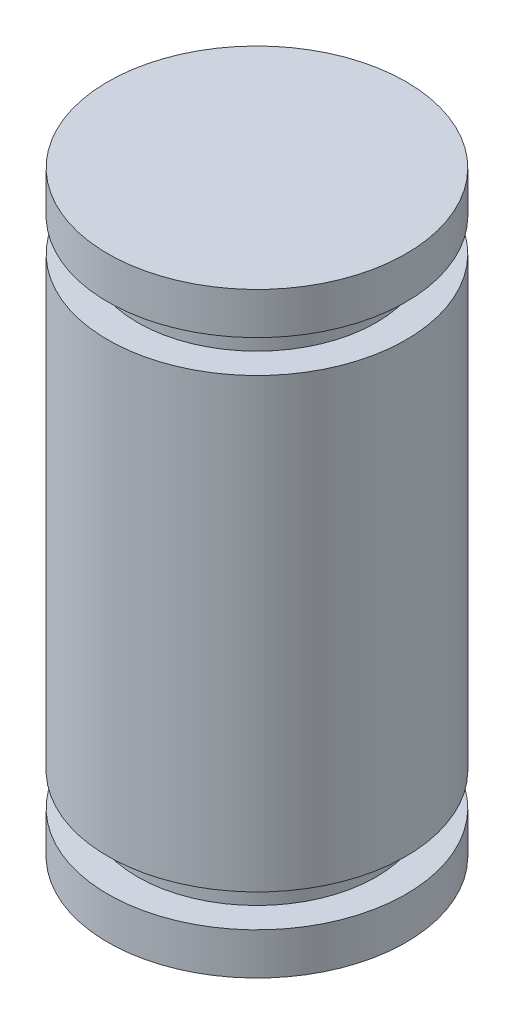
ISO-10303-21;
HEADER;
FILE_DESCRIPTION(('STEP AP214'),'2;1');
FILE_NAME('part.step','',(''),(''),'','','');
FILE_SCHEMA(('AUTOMOTIVE_DESIGN { 1 0 10303 214 1 1 1 1 }'));
ENDSEC;
DATA;
#1=APPLICATION_CONTEXT('core data for automotive mechanical design processes');
#2=APPLICATION_PROTOCOL_DEFINITION('international standard','automotive_design',2000,#1);
#3=PRODUCT_CONTEXT('',#1,'mechanical');
#4=PRODUCT('Part','Part','',(#3));
#5=PRODUCT_RELATED_PRODUCT_CATEGORY('part','',(#4));
#6=PRODUCT_DEFINITION_FORMATION('','',#4);
#7=PRODUCT_DEFINITION_CONTEXT('part definition',#1,'design');
#8=PRODUCT_DEFINITION('design','',#6,#7);
#9=PRODUCT_DEFINITION_SHAPE('','',#8);
#10=(LENGTH_UNIT() NAMED_UNIT(*) SI_UNIT(.MILLI.,.METRE.));
#11=(NAMED_UNIT(*) PLANE_ANGLE_UNIT() SI_UNIT($,.RADIAN.));
#12=(NAMED_UNIT(*) SI_UNIT($,.STERADIAN.) SOLID_ANGLE_UNIT());
#13=UNCERTAINTY_MEASURE_WITH_UNIT(LENGTH_MEASURE(1.E-05),#10,'distance_accuracy_value','');
#14=(GEOMETRIC_REPRESENTATION_CONTEXT(3) GLOBAL_UNCERTAINTY_ASSIGNED_CONTEXT((#13)) GLOBAL_UNIT_ASSIGNED_CONTEXT((#10,
#11,#12)) REPRESENTATION_CONTEXT('',''));
#15=CARTESIAN_POINT('',(0.,0.,0.));
#16=DIRECTION('',(0.,0.,1.));
#17=DIRECTION('',(1.,0.,0.));
#18=AXIS2_PLACEMENT_3D('',#15,#16,#17);
#19=CARTESIAN_POINT('',(0.,0.,0.));
#20=DIRECTION('',(0.,1.,0.));
#21=DIRECTION('',(0.,0.,1.));
#22=AXIS2_PLACEMENT_3D('',#19,#20,#21);
#23=PLANE('',#22);
#24=CARTESIAN_POINT('',(0.,0.,0.));
#25=DIRECTION('',(0.,-1.,0.));
#26=DIRECTION('',(0.,0.,-1.));
#27=AXIS2_PLACEMENT_3D('',#24,#25,#26);
#28=CIRCLE('',#27,5.);
#29=CARTESIAN_POINT('',(0.,0.,-5.));
#30=VERTEX_POINT('',#29);
#31=EDGE_CURVE('E10',#30,#30,#28,.T.);
#32=ORIENTED_EDGE('',*,*,#31,.T.);
#33=EDGE_LOOP('',(#32));
#34=FACE_BOUND('',#33,.T.);
#35=ADVANCED_FACE('F37',(#34),#23,.F.);
#36=CARTESIAN_POINT('',(0.,0.,0.));
#37=DIRECTION('',(0.,-1.,0.));
#38=DIRECTION('',(0.,0.,-1.));
#39=AXIS2_PLACEMENT_3D('',#36,#37,#38);
#40=CYLINDRICAL_SURFACE('',#39,5.);
#41=ORIENTED_EDGE('',*,*,#31,.F.);
#42=EDGE_LOOP('',(#41));
#43=FACE_BOUND('',#42,.T.);
#44=CARTESIAN_POINT('',(0.,1.4,0.));
#45=DIRECTION('',(0.,-1.,0.));
#46=DIRECTION('',(0.,0.,-1.));
#47=AXIS2_PLACEMENT_3D('',#44,#45,#46);
#48=CIRCLE('',#47,5.);
#49=CARTESIAN_POINT('',(0.,1.4,-5.));
#50=VERTEX_POINT('',#49);
#51=EDGE_CURVE('E44',#50,#50,#48,.T.);
#52=ORIENTED_EDGE('',*,*,#51,.T.);
#53=EDGE_LOOP('',(#52));
#54=FACE_BOUND('',#53,.T.);
#55=ADVANCED_FACE('F97',(#43,#54),#40,.T.);
#56=CARTESIAN_POINT('',(-5.,1.4,0.));
#57=DIRECTION('',(0.,-1.,0.));
#58=DIRECTION('',(0.,0.,-1.));
#59=AXIS2_PLACEMENT_3D('',#56,#57,#58);
#60=PLANE('',#59);
#61=ORIENTED_EDGE('',*,*,#51,.F.);
#62=EDGE_LOOP('',(#61));
#63=FACE_BOUND('',#62,.T.);
#64=CARTESIAN_POINT('',(0.,1.4,0.));
#65=DIRECTION('',(0.,-1.,0.));
#66=DIRECTION('',(0.,0.,-1.));
#67=AXIS2_PLACEMENT_3D('',#64,#65,#66);
#68=CIRCLE('',#67,4.);
#69=CARTESIAN_POINT('',(0.,1.4,-4.));
#70=VERTEX_POINT('',#69);
#71=EDGE_CURVE('E49',#70,#70,#68,.T.);
#72=ORIENTED_EDGE('',*,*,#71,.T.);
#73=EDGE_LOOP('',(#72));
#74=FACE_BOUND('',#73,.T.);
#75=ADVANCED_FACE('F101',(#63,#74),#60,.F.);
#76=CARTESIAN_POINT('',(0.,0.,0.));
#77=DIRECTION('',(0.,-1.,0.));
#78=DIRECTION('',(0.,0.,-1.));
#79=AXIS2_PLACEMENT_3D('',#76,#77,#78);
#80=CYLINDRICAL_SURFACE('',#79,4.);
#81=ORIENTED_EDGE('',*,*,#71,.F.);
#82=EDGE_LOOP('',(#81));
#83=FACE_BOUND('',#82,.T.);
#84=CARTESIAN_POINT('',(0.,2.5,0.));
#85=DIRECTION('',(0.,-1.,0.));
#86=DIRECTION('',(0.,0.,-1.));
#87=AXIS2_PLACEMENT_3D('',#84,#85,#86);
#88=CIRCLE('',#87,4.);
#89=CARTESIAN_POINT('',(0.,2.5,-4.));
#90=VERTEX_POINT('',#89);
#91=EDGE_CURVE('E54',#90,#90,#88,.T.);
#92=ORIENTED_EDGE('',*,*,#91,.T.);
#93=EDGE_LOOP('',(#92));
#94=FACE_BOUND('',#93,.T.);
#95=ADVANCED_FACE('F106',(#83,#94),#80,.T.);
#96=CARTESIAN_POINT('',(-4.,2.5,0.));
#97=DIRECTION('',(0.,1.,0.));
#98=DIRECTION('',(0.,0.,1.));
#99=AXIS2_PLACEMENT_3D('',#96,#97,#98);
#100=PLANE('',#99);
#101=ORIENTED_EDGE('',*,*,#91,.F.);
#102=EDGE_LOOP('',(#101));
#103=FACE_BOUND('',#102,.T.);
#104=CARTESIAN_POINT('',(0.,2.5,0.));
#105=DIRECTION('',(0.,-1.,0.));
#106=DIRECTION('',(0.,0.,-1.));
#107=AXIS2_PLACEMENT_3D('',#104,#105,#106);
#108=CIRCLE('',#107,5.);
#109=CARTESIAN_POINT('',(0.,2.5,-5.));
#110=VERTEX_POINT('',#109);
#111=EDGE_CURVE('E60',#110,#110,#108,.T.);
#112=ORIENTED_EDGE('',*,*,#111,.T.);
#113=EDGE_LOOP('',(#112));
#114=FACE_BOUND('',#113,.T.);
#115=ADVANCED_FACE('F112',(#103,#114),#100,.F.);
#116=CARTESIAN_POINT('',(0.,0.,0.));
#117=DIRECTION('',(0.,-1.,0.));
#118=DIRECTION('',(0.,0.,-1.));
#119=AXIS2_PLACEMENT_3D('',#116,#117,#118);
#120=CYLINDRICAL_SURFACE('',#119,5.);
#121=ORIENTED_EDGE('',*,*,#111,.F.);
#122=EDGE_LOOP('',(#121));
#123=FACE_BOUND('',#122,.T.);
#124=CARTESIAN_POINT('',(0.,17.5,0.));
#125=DIRECTION('',(0.,-1.,0.));
#126=DIRECTION('',(0.,0.,-1.));
#127=AXIS2_PLACEMENT_3D('',#124,#125,#126);
#128=CIRCLE('',#127,5.);
#129=CARTESIAN_POINT('',(0.,17.5,-5.));
#130=VERTEX_POINT('',#129);
#131=EDGE_CURVE('E64',#130,#130,#128,.T.);
#132=ORIENTED_EDGE('',*,*,#131,.T.);
#133=EDGE_LOOP('',(#132));
#134=FACE_BOUND('',#133,.T.);
#135=ADVANCED_FACE('F116',(#123,#134),#120,.T.);
#136=CARTESIAN_POINT('',(-5.,17.5,0.));
#137=DIRECTION('',(0.,-1.,0.));
#138=DIRECTION('',(0.,0.,-1.));
#139=AXIS2_PLACEMENT_3D('',#136,#137,#138);
#140=PLANE('',#139);
#141=ORIENTED_EDGE('',*,*,#131,.F.);
#142=EDGE_LOOP('',(#141));
#143=FACE_BOUND('',#142,.T.);
#144=CARTESIAN_POINT('',(0.,17.5,0.));
#145=DIRECTION('',(0.,-1.,0.));
#146=DIRECTION('',(0.,0.,-1.));
#147=AXIS2_PLACEMENT_3D('',#144,#145,#146);
#148=CIRCLE('',#147,4.);
#149=CARTESIAN_POINT('',(0.,17.5,-4.));
#150=VERTEX_POINT('',#149);
#151=EDGE_CURVE('E68',#150,#150,#148,.T.);
#152=ORIENTED_EDGE('',*,*,#151,.T.);
#153=EDGE_LOOP('',(#152));
#154=FACE_BOUND('',#153,.T.);
#155=ADVANCED_FACE('F120',(#143,#154),#140,.F.);
#156=CARTESIAN_POINT('',(0.,0.,0.));
#157=DIRECTION('',(0.,-1.,0.));
#158=DIRECTION('',(0.,0.,-1.));
#159=AXIS2_PLACEMENT_3D('',#156,#157,#158);
#160=CYLINDRICAL_SURFACE('',#159,4.);
#161=ORIENTED_EDGE('',*,*,#151,.F.);
#162=EDGE_LOOP('',(#161));
#163=FACE_BOUND('',#162,.T.);
#164=CARTESIAN_POINT('',(0.,18.6,0.));
#165=DIRECTION('',(0.,-1.,0.));
#166=DIRECTION('',(0.,0.,-1.));
#167=AXIS2_PLACEMENT_3D('',#164,#165,#166);
#168=CIRCLE('',#167,4.);
#169=CARTESIAN_POINT('',(0.,18.6,-4.));
#170=VERTEX_POINT('',#169);
#171=EDGE_CURVE('E72',#170,#170,#168,.T.);
#172=ORIENTED_EDGE('',*,*,#171,.T.);
#173=EDGE_LOOP('',(#172));
#174=FACE_BOUND('',#173,.T.);
#175=ADVANCED_FACE('F124',(#163,#174),#160,.T.);
#176=CARTESIAN_POINT('',(-4.,18.6,0.));
#177=DIRECTION('',(0.,1.,0.));
#178=DIRECTION('',(0.,0.,1.));
#179=AXIS2_PLACEMENT_3D('',#176,#177,#178);
#180=PLANE('',#179);
#181=ORIENTED_EDGE('',*,*,#171,.F.);
#182=EDGE_LOOP('',(#181));
#183=FACE_BOUND('',#182,.T.);
#184=CARTESIAN_POINT('',(0.,18.6,0.));
#185=DIRECTION('',(0.,-1.,0.));
#186=DIRECTION('',(0.,0.,-1.));
#187=AXIS2_PLACEMENT_3D('',#184,#185,#186);
#188=CIRCLE('',#187,5.);
#189=CARTESIAN_POINT('',(0.,18.6,-5.));
#190=VERTEX_POINT('',#189);
#191=EDGE_CURVE('E76',#190,#190,#188,.T.);
#192=ORIENTED_EDGE('',*,*,#191,.T.);
#193=EDGE_LOOP('',(#192));
#194=FACE_BOUND('',#193,.T.);
#195=ADVANCED_FACE('F93',(#183,#194),#180,.F.);
#196=CARTESIAN_POINT('',(0.,0.,0.));
#197=DIRECTION('',(0.,-1.,0.));
#198=DIRECTION('',(0.,0.,-1.));
#199=AXIS2_PLACEMENT_3D('',#196,#197,#198);
#200=CYLINDRICAL_SURFACE('',#199,5.);
#201=ORIENTED_EDGE('',*,*,#191,.F.);
#202=EDGE_LOOP('',(#201));
#203=FACE_BOUND('',#202,.T.);
#204=CARTESIAN_POINT('',(0.,20.,0.));
#205=DIRECTION('',(0.,-1.,0.));
#206=DIRECTION('',(0.,0.,-1.));
#207=AXIS2_PLACEMENT_3D('',#204,#205,#206);
#208=CIRCLE('',#207,5.);
#209=CARTESIAN_POINT('',(0.,20.,-5.));
#210=VERTEX_POINT('',#209);
#211=EDGE_CURVE('E80',#210,#210,#208,.T.);
#212=ORIENTED_EDGE('',*,*,#211,.T.);
#213=EDGE_LOOP('',(#212));
#214=FACE_BOUND('',#213,.T.);
#215=ADVANCED_FACE('F85',(#203,#214),#200,.T.);
#216=CARTESIAN_POINT('',(-5.,20.,0.));
#217=DIRECTION('',(0.,-1.,0.));
#218=DIRECTION('',(0.,0.,-1.));
#219=AXIS2_PLACEMENT_3D('',#216,#217,#218);
#220=PLANE('',#219);
#221=ORIENTED_EDGE('',*,*,#211,.F.);
#222=EDGE_LOOP('',(#221));
#223=FACE_BOUND('',#222,.T.);
#224=ADVANCED_FACE('F87',(#223),#220,.F.);
#225=CLOSED_SHELL('',(#35,#55,#75,#95,#115,#135,#155,#175,#195,#215,#224));
#226=MANIFOLD_SOLID_BREP('B2',#225);
#227=ADVANCED_BREP_SHAPE_REPRESENTATION('',(#18,#226),#14);
#228=SHAPE_DEFINITION_REPRESENTATION(#9,#227);
ENDSEC;
END-ISO-10303-21;
